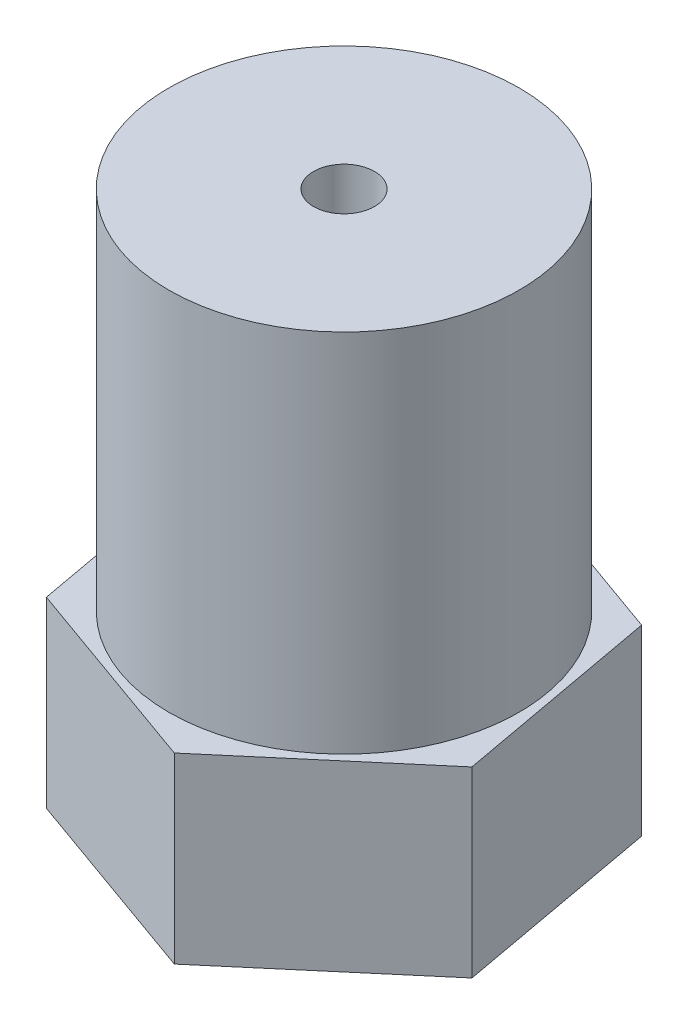
ISO-10303-21;
HEADER;
FILE_DESCRIPTION(('STEP AP214'),'2;1');
FILE_NAME('part.step','',(''),(''),'','','');
FILE_SCHEMA(('AUTOMOTIVE_DESIGN { 1 0 10303 214 1 1 1 1 }'));
ENDSEC;
DATA;
#1=APPLICATION_CONTEXT('core data for automotive mechanical design processes');
#2=APPLICATION_PROTOCOL_DEFINITION('international standard','automotive_design',2000,#1);
#3=PRODUCT_CONTEXT('',#1,'mechanical');
#4=PRODUCT('Part','Part','',(#3));
#5=PRODUCT_RELATED_PRODUCT_CATEGORY('part','',(#4));
#6=PRODUCT_DEFINITION_FORMATION('','',#4);
#7=PRODUCT_DEFINITION_CONTEXT('part definition',#1,'design');
#8=PRODUCT_DEFINITION('design','',#6,#7);
#9=PRODUCT_DEFINITION_SHAPE('','',#8);
#10=(LENGTH_UNIT() NAMED_UNIT(*) SI_UNIT(.MILLI.,.METRE.));
#11=(NAMED_UNIT(*) PLANE_ANGLE_UNIT() SI_UNIT($,.RADIAN.));
#12=(NAMED_UNIT(*) SI_UNIT($,.STERADIAN.) SOLID_ANGLE_UNIT());
#13=UNCERTAINTY_MEASURE_WITH_UNIT(LENGTH_MEASURE(1.E-05),#10,'distance_accuracy_value','');
#14=(GEOMETRIC_REPRESENTATION_CONTEXT(3) GLOBAL_UNCERTAINTY_ASSIGNED_CONTEXT((#13)) GLOBAL_UNIT_ASSIGNED_CONTEXT((#10,
#11,#12)) REPRESENTATION_CONTEXT('',''));
#15=CARTESIAN_POINT('',(0.,0.,0.));
#16=DIRECTION('',(0.,0.,1.));
#17=DIRECTION('',(1.,0.,0.));
#18=AXIS2_PLACEMENT_3D('',#15,#16,#17);
#19=CARTESIAN_POINT('',(6.52701802878504,6.,2.32871974524954));
#20=DIRECTION('',(-0.983683015369645,0.,0.179910325643866));
#21=DIRECTION('',(0.179910325643866,0.,0.983683015369645));
#22=AXIS2_PLACEMENT_3D('',#19,#20,#21);
#23=PLANE('',#22);
#24=DIRECTION('',(-0.179910325643866,0.,-0.983683015369645));
#25=VECTOR('',#24,1.);
#26=CARTESIAN_POINT('',(6.52701802878504,0.,2.32871974524954));
#27=LINE('',#26,#25);
#28=CARTESIAN_POINT('',(6.52701802878504,0.,2.32871974524954));
#29=VERTEX_POINT('',#28);
#30=CARTESIAN_POINT('',(5.28023947207305,0.,-4.48820355126211));
#31=VERTEX_POINT('',#30);
#32=EDGE_CURVE('E121',#29,#31,#27,.T.);
#33=ORIENTED_EDGE('',*,*,#32,.T.);
#34=DIRECTION('',(0.,-1.,0.));
#35=VECTOR('',#34,1.);
#36=CARTESIAN_POINT('',(5.28023947207305,6.,-4.48820355126211));
#37=LINE('',#36,#35);
#38=CARTESIAN_POINT('',(5.28023947207305,6.,-4.48820355126211));
#39=VERTEX_POINT('',#38);
#40=EDGE_CURVE('E11',#39,#31,#37,.T.);
#41=ORIENTED_EDGE('',*,*,#40,.F.);
#42=DIRECTION('',(-0.179910325643866,0.,-0.983683015369645));
#43=VECTOR('',#42,1.);
#44=CARTESIAN_POINT('',(6.52701802878504,6.,2.32871974524954));
#45=LINE('',#44,#43);
#46=CARTESIAN_POINT('',(6.52701802878504,6.,2.32871974524954));
#47=VERTEX_POINT('',#46);
#48=EDGE_CURVE('E132',#47,#39,#45,.T.);
#49=ORIENTED_EDGE('',*,*,#48,.F.);
#50=DIRECTION('',(0.,-1.,0.));
#51=VECTOR('',#50,1.);
#52=CARTESIAN_POINT('',(6.52701802878504,6.,2.32871974524954));
#53=LINE('',#52,#51);
#54=EDGE_CURVE('E117',#47,#29,#53,.T.);
#55=ORIENTED_EDGE('',*,*,#54,.T.);
#56=EDGE_LOOP('',(#33,#41,#49,#55));
#57=FACE_BOUND('',#56,.T.);
#58=ADVANCED_FACE('F37',(#57),#23,.F.);
#59=CARTESIAN_POINT('',(5.28023947207305,6.,-4.48820355126211));
#60=DIRECTION('',(-0.336034595274104,0.,0.941849643403324));
#61=DIRECTION('',(0.941849643403325,0.,0.336034595274104));
#62=AXIS2_PLACEMENT_3D('',#59,#60,#61);
#63=PLANE('',#62);
#64=DIRECTION('',(-0.941849643403324,0.,-0.336034595274104));
#65=VECTOR('',#64,1.);
#66=CARTESIAN_POINT('',(5.28023947207305,0.,-4.48820355126211));
#67=LINE('',#66,#65);
#68=CARTESIAN_POINT('',(-1.24677855671199,0.,-6.81692329651164));
#69=VERTEX_POINT('',#68);
#70=EDGE_CURVE('E124',#31,#69,#67,.T.);
#71=ORIENTED_EDGE('',*,*,#70,.T.);
#72=DIRECTION('',(0.,-1.,0.));
#73=VECTOR('',#72,1.);
#74=CARTESIAN_POINT('',(-1.24677855671199,6.,-6.81692329651164));
#75=LINE('',#74,#73);
#76=CARTESIAN_POINT('',(-1.24677855671199,6.,-6.81692329651164));
#77=VERTEX_POINT('',#76);
#78=EDGE_CURVE('E45',#77,#69,#75,.T.);
#79=ORIENTED_EDGE('',*,*,#78,.F.);
#80=DIRECTION('',(-0.941849643403324,0.,-0.336034595274104));
#81=VECTOR('',#80,1.);
#82=CARTESIAN_POINT('',(5.28023947207305,6.,-4.48820355126211));
#83=LINE('',#82,#81);
#84=EDGE_CURVE('E90',#39,#77,#83,.T.);
#85=ORIENTED_EDGE('',*,*,#84,.F.);
#86=ORIENTED_EDGE('',*,*,#40,.T.);
#87=EDGE_LOOP('',(#71,#79,#85,#86));
#88=FACE_BOUND('',#87,.T.);
#89=ADVANCED_FACE('F157',(#88),#63,.F.);
#90=CARTESIAN_POINT('',(-1.24677855671199,6.,-6.81692329651164));
#91=DIRECTION('',(0.647648420095542,0.,0.761939317759458));
#92=DIRECTION('',(0.761939317759458,0.,-0.647648420095542));
#93=AXIS2_PLACEMENT_3D('',#90,#91,#92);
#94=PLANE('',#93);
#95=DIRECTION('',(-0.761939317759458,0.,0.647648420095542));
#96=VECTOR('',#95,1.);
#97=CARTESIAN_POINT('',(-1.24677855671199,0.,-6.81692329651164));
#98=LINE('',#97,#96);
#99=CARTESIAN_POINT('',(-6.52701802878504,0.,-2.32871974524954));
#100=VERTEX_POINT('',#99);
#101=EDGE_CURVE('E127',#69,#100,#98,.T.);
#102=ORIENTED_EDGE('',*,*,#101,.T.);
#103=DIRECTION('',(0.,-1.,0.));
#104=VECTOR('',#103,1.);
#105=CARTESIAN_POINT('',(-6.52701802878504,6.,-2.32871974524954));
#106=LINE('',#105,#104);
#107=CARTESIAN_POINT('',(-6.52701802878504,6.,-2.32871974524954));
#108=VERTEX_POINT('',#107);
#109=EDGE_CURVE('E112',#108,#100,#106,.T.);
#110=ORIENTED_EDGE('',*,*,#109,.F.);
#111=DIRECTION('',(-0.761939317759458,0.,0.647648420095542));
#112=VECTOR('',#111,1.);
#113=CARTESIAN_POINT('',(-1.24677855671199,6.,-6.81692329651164));
#114=LINE('',#113,#112);
#115=EDGE_CURVE('E103',#77,#108,#114,.T.);
#116=ORIENTED_EDGE('',*,*,#115,.F.);
#117=ORIENTED_EDGE('',*,*,#78,.T.);
#118=EDGE_LOOP('',(#102,#110,#116,#117));
#119=FACE_BOUND('',#118,.T.);
#120=ADVANCED_FACE('F138',(#119),#94,.F.);
#121=CARTESIAN_POINT('',(-6.52701802878504,6.,-2.32871974524954));
#122=DIRECTION('',(0.983683015369645,0.,-0.179910325643866));
#123=DIRECTION('',(-0.179910325643866,0.,-0.983683015369646));
#124=AXIS2_PLACEMENT_3D('',#121,#122,#123);
#125=PLANE('',#124);
#126=DIRECTION('',(0.179910325643866,0.,0.983683015369645));
#127=VECTOR('',#126,1.);
#128=CARTESIAN_POINT('',(-6.52701802878504,0.,-2.32871974524954));
#129=LINE('',#128,#127);
#130=CARTESIAN_POINT('',(-5.28023947207305,0.,4.48820355126211));
#131=VERTEX_POINT('',#130);
#132=EDGE_CURVE('E111',#100,#131,#129,.T.);
#133=ORIENTED_EDGE('',*,*,#132,.T.);
#134=DIRECTION('',(0.,-1.,0.));
#135=VECTOR('',#134,1.);
#136=CARTESIAN_POINT('',(-5.28023947207305,6.,4.48820355126211));
#137=LINE('',#136,#135);
#138=CARTESIAN_POINT('',(-5.28023947207305,6.,4.48820355126211));
#139=VERTEX_POINT('',#138);
#140=EDGE_CURVE('E108',#139,#131,#137,.T.);
#141=ORIENTED_EDGE('',*,*,#140,.F.);
#142=DIRECTION('',(0.179910325643866,0.,0.983683015369645));
#143=VECTOR('',#142,1.);
#144=CARTESIAN_POINT('',(-6.52701802878504,6.,-2.32871974524954));
#145=LINE('',#144,#143);
#146=EDGE_CURVE('E97',#108,#139,#145,.T.);
#147=ORIENTED_EDGE('',*,*,#146,.F.);
#148=ORIENTED_EDGE('',*,*,#109,.T.);
#149=EDGE_LOOP('',(#133,#141,#147,#148));
#150=FACE_BOUND('',#149,.T.);
#151=ADVANCED_FACE('F109',(#150),#125,.F.);
#152=CARTESIAN_POINT('',(-5.28023947207305,6.,4.48820355126211));
#153=DIRECTION('',(0.336034595274104,0.,-0.941849643403324));
#154=DIRECTION('',(-0.941849643403324,0.,-0.336034595274104));
#155=AXIS2_PLACEMENT_3D('',#152,#153,#154);
#156=PLANE('',#155);
#157=DIRECTION('',(0.941849643403324,0.,0.336034595274104));
#158=VECTOR('',#157,1.);
#159=CARTESIAN_POINT('',(-5.28023947207305,0.,4.48820355126211));
#160=LINE('',#159,#158);
#161=CARTESIAN_POINT('',(1.24677855671199,0.,6.81692329651164));
#162=VERTEX_POINT('',#161);
#163=EDGE_CURVE('E76',#131,#162,#160,.T.);
#164=ORIENTED_EDGE('',*,*,#163,.T.);
#165=DIRECTION('',(0.,-1.,0.));
#166=VECTOR('',#165,1.);
#167=CARTESIAN_POINT('',(1.24677855671199,6.,6.81692329651164));
#168=LINE('',#167,#166);
#169=CARTESIAN_POINT('',(1.24677855671199,6.,6.81692329651164));
#170=VERTEX_POINT('',#169);
#171=EDGE_CURVE('E113',#170,#162,#168,.T.);
#172=ORIENTED_EDGE('',*,*,#171,.F.);
#173=DIRECTION('',(0.941849643403324,0.,0.336034595274104));
#174=VECTOR('',#173,1.);
#175=CARTESIAN_POINT('',(-5.28023947207305,6.,4.48820355126211));
#176=LINE('',#175,#174);
#177=EDGE_CURVE('E101',#139,#170,#176,.T.);
#178=ORIENTED_EDGE('',*,*,#177,.F.);
#179=ORIENTED_EDGE('',*,*,#140,.T.);
#180=EDGE_LOOP('',(#164,#172,#178,#179));
#181=FACE_BOUND('',#180,.T.);
#182=ADVANCED_FACE('F115',(#181),#156,.F.);
#183=CARTESIAN_POINT('',(1.24677855671199,6.,6.81692329651164));
#184=DIRECTION('',(-0.647648420095542,0.,-0.761939317759458));
#185=DIRECTION('',(-0.761939317759458,0.,0.647648420095542));
#186=AXIS2_PLACEMENT_3D('',#183,#184,#185);
#187=PLANE('',#186);
#188=DIRECTION('',(0.761939317759458,0.,-0.647648420095542));
#189=VECTOR('',#188,1.);
#190=CARTESIAN_POINT('',(1.24677855671199,0.,6.81692329651164));
#191=LINE('',#190,#189);
#192=EDGE_CURVE('E82',#162,#29,#191,.T.);
#193=ORIENTED_EDGE('',*,*,#192,.T.);
#194=ORIENTED_EDGE('',*,*,#54,.F.);
#195=DIRECTION('',(0.761939317759458,0.,-0.647648420095542));
#196=VECTOR('',#195,1.);
#197=CARTESIAN_POINT('',(1.24677855671199,6.,6.81692329651164));
#198=LINE('',#197,#196);
#199=EDGE_CURVE('E53',#170,#47,#198,.T.);
#200=ORIENTED_EDGE('',*,*,#199,.F.);
#201=ORIENTED_EDGE('',*,*,#171,.T.);
#202=EDGE_LOOP('',(#193,#194,#200,#201));
#203=FACE_BOUND('',#202,.T.);
#204=ADVANCED_FACE('F145',(#203),#187,.F.);
#205=CARTESIAN_POINT('',(0.,6.,0.));
#206=DIRECTION('',(0.,1.,0.));
#207=DIRECTION('',(0.,0.,1.));
#208=AXIS2_PLACEMENT_3D('',#205,#206,#207);
#209=PLANE('',#208);
#210=CARTESIAN_POINT('',(0.,6.,0.));
#211=DIRECTION('',(0.,1.,0.));
#212=DIRECTION('',(0.,0.,1.));
#213=AXIS2_PLACEMENT_3D('',#210,#211,#212);
#214=CIRCLE('',#213,5.75);
#215=CARTESIAN_POINT('',(0.,6.,5.75));
#216=VERTEX_POINT('',#215);
#217=EDGE_CURVE('E255',#216,#216,#214,.T.);
#218=ORIENTED_EDGE('',*,*,#217,.F.);
#219=EDGE_LOOP('',(#218));
#220=FACE_BOUND('',#219,.T.);
#221=ORIENTED_EDGE('',*,*,#48,.T.);
#222=ORIENTED_EDGE('',*,*,#84,.T.);
#223=ORIENTED_EDGE('',*,*,#115,.T.);
#224=ORIENTED_EDGE('',*,*,#146,.T.);
#225=ORIENTED_EDGE('',*,*,#177,.T.);
#226=ORIENTED_EDGE('',*,*,#199,.T.);
#227=EDGE_LOOP('',(#221,#222,#223,#224,#225,#226));
#228=FACE_BOUND('',#227,.T.);
#229=ADVANCED_FACE('F99',(#220,#228),#209,.T.);
#230=CARTESIAN_POINT('',(0.,0.,0.));
#231=DIRECTION('',(0.,1.,0.));
#232=DIRECTION('',(0.,0.,1.));
#233=AXIS2_PLACEMENT_3D('',#230,#231,#232);
#234=PLANE('',#233);
#235=CARTESIAN_POINT('',(0.,0.,0.));
#236=DIRECTION('',(0.,1.,0.));
#237=DIRECTION('',(0.,0.,1.));
#238=AXIS2_PLACEMENT_3D('',#235,#236,#237);
#239=CIRCLE('',#238,2.);
#240=CARTESIAN_POINT('',(0.,0.,2.));
#241=VERTEX_POINT('',#240);
#242=EDGE_CURVE('E125',#241,#241,#239,.T.);
#243=ORIENTED_EDGE('',*,*,#242,.T.);
#244=EDGE_LOOP('',(#243));
#245=FACE_BOUND('',#244,.T.);
#246=ORIENTED_EDGE('',*,*,#32,.F.);
#247=ORIENTED_EDGE('',*,*,#192,.F.);
#248=ORIENTED_EDGE('',*,*,#163,.F.);
#249=ORIENTED_EDGE('',*,*,#132,.F.);
#250=ORIENTED_EDGE('',*,*,#101,.F.);
#251=ORIENTED_EDGE('',*,*,#70,.F.);
#252=EDGE_LOOP('',(#246,#247,#248,#249,#250,#251));
#253=FACE_BOUND('',#252,.T.);
#254=ADVANCED_FACE('F141',(#245,#253),#234,.F.);
#255=CARTESIAN_POINT('',(0.,0.,0.));
#256=DIRECTION('',(0.,1.,0.));
#257=DIRECTION('',(0.,0.,1.));
#258=AXIS2_PLACEMENT_3D('',#255,#256,#257);
#259=CYLINDRICAL_SURFACE('',#258,2.);
#260=ORIENTED_EDGE('',*,*,#242,.F.);
#261=EDGE_LOOP('',(#260));
#262=FACE_BOUND('',#261,.T.);
#263=CARTESIAN_POINT('',(0.,6.,0.));
#264=DIRECTION('',(0.,1.,0.));
#265=DIRECTION('',(0.,0.,1.));
#266=AXIS2_PLACEMENT_3D('',#263,#264,#265);
#267=CIRCLE('',#266,2.);
#268=CARTESIAN_POINT('',(0.,6.,2.));
#269=VERTEX_POINT('',#268);
#270=EDGE_CURVE('E261',#269,#269,#267,.F.);
#271=ORIENTED_EDGE('',*,*,#270,.F.);
#272=EDGE_LOOP('',(#271));
#273=FACE_BOUND('',#272,.T.);
#274=ADVANCED_FACE('F189',(#262,#273),#259,.F.);
#275=CARTESIAN_POINT('',(0.,6.,0.));
#276=DIRECTION('',(0.,1.,0.));
#277=DIRECTION('',(0.,0.,1.));
#278=AXIS2_PLACEMENT_3D('',#275,#276,#277);
#279=PLANE('',#278);
#280=CARTESIAN_POINT('',(0.,6.,0.));
#281=DIRECTION('',(0.,1.,0.));
#282=DIRECTION('',(0.,0.,1.));
#283=AXIS2_PLACEMENT_3D('',#280,#281,#282);
#284=CIRCLE('',#283,1.);
#285=CARTESIAN_POINT('',(0.,6.,1.));
#286=VERTEX_POINT('',#285);
#287=EDGE_CURVE('E250',#286,#286,#284,.T.);
#288=ORIENTED_EDGE('',*,*,#287,.T.);
#289=EDGE_LOOP('',(#288));
#290=FACE_BOUND('',#289,.T.);
#291=ORIENTED_EDGE('',*,*,#270,.T.);
#292=EDGE_LOOP('',(#291));
#293=FACE_BOUND('',#292,.T.);
#294=ADVANCED_FACE('F198',(#290,#293),#279,.F.);
#295=CARTESIAN_POINT('',(0.,18.,0.));
#296=DIRECTION('',(0.,-1.,0.));
#297=DIRECTION('',(0.,0.,-1.));
#298=AXIS2_PLACEMENT_3D('',#295,#296,#297);
#299=CYLINDRICAL_SURFACE('',#298,5.75);
#300=CARTESIAN_POINT('',(0.,18.,0.));
#301=DIRECTION('',(0.,1.,0.));
#302=DIRECTION('',(0.,0.,1.));
#303=AXIS2_PLACEMENT_3D('',#300,#301,#302);
#304=CIRCLE('',#303,5.75);
#305=CARTESIAN_POINT('',(0.,18.,5.75));
#306=VERTEX_POINT('',#305);
#307=EDGE_CURVE('E258',#306,#306,#304,.T.);
#308=ORIENTED_EDGE('',*,*,#307,.F.);
#309=EDGE_LOOP('',(#308));
#310=FACE_BOUND('',#309,.T.);
#311=ORIENTED_EDGE('',*,*,#217,.T.);
#312=EDGE_LOOP('',(#311));
#313=FACE_BOUND('',#312,.T.);
#314=ADVANCED_FACE('F211',(#310,#313),#299,.T.);
#315=CARTESIAN_POINT('',(0.,18.,0.));
#316=DIRECTION('',(0.,1.,0.));
#317=DIRECTION('',(0.,0.,1.));
#318=AXIS2_PLACEMENT_3D('',#315,#316,#317);
#319=PLANE('',#318);
#320=CARTESIAN_POINT('',(0.,18.,0.));
#321=DIRECTION('',(0.,1.,0.));
#322=DIRECTION('',(0.,0.,1.));
#323=AXIS2_PLACEMENT_3D('',#320,#321,#322);
#324=CIRCLE('',#323,1.);
#325=CARTESIAN_POINT('',(0.,18.,1.));
#326=VERTEX_POINT('',#325);
#327=EDGE_CURVE('E253',#326,#326,#324,.T.);
#328=ORIENTED_EDGE('',*,*,#327,.F.);
#329=EDGE_LOOP('',(#328));
#330=FACE_BOUND('',#329,.T.);
#331=ORIENTED_EDGE('',*,*,#307,.T.);
#332=EDGE_LOOP('',(#331));
#333=FACE_BOUND('',#332,.T.);
#334=ADVANCED_FACE('F216',(#330,#333),#319,.T.);
#335=CARTESIAN_POINT('',(0.,6.,0.));
#336=DIRECTION('',(0.,1.,0.));
#337=DIRECTION('',(0.,0.,1.));
#338=AXIS2_PLACEMENT_3D('',#335,#336,#337);
#339=CYLINDRICAL_SURFACE('',#338,1.);
#340=ORIENTED_EDGE('',*,*,#287,.F.);
#341=EDGE_LOOP('',(#340));
#342=FACE_BOUND('',#341,.T.);
#343=ORIENTED_EDGE('',*,*,#327,.T.);
#344=EDGE_LOOP('',(#343));
#345=FACE_BOUND('',#344,.T.);
#346=ADVANCED_FACE('F233',(#342,#345),#339,.F.);
#347=CLOSED_SHELL('',(#58,#89,#120,#151,#182,#204,#229,#254,#274,#294,#314,#334,#346));
#348=MANIFOLD_SOLID_BREP('B2',#347);
#349=ADVANCED_BREP_SHAPE_REPRESENTATION('',(#18,#348),#14);
#350=SHAPE_DEFINITION_REPRESENTATION(#9,#349);
ENDSEC;
END-ISO-10303-21;
